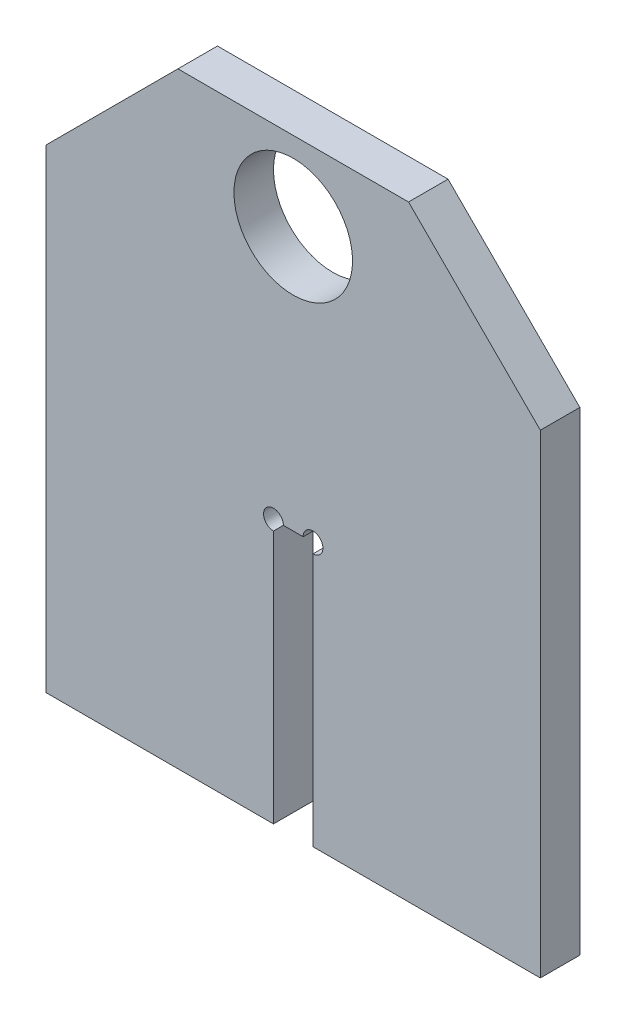
ISO-10303-21;
HEADER;
FILE_DESCRIPTION(('STEP AP214'),'2;1');
FILE_NAME('part.step','',(''),(''),'','','');
FILE_SCHEMA(('AUTOMOTIVE_DESIGN { 1 0 10303 214 1 1 1 1 }'));
ENDSEC;
DATA;
#1=APPLICATION_CONTEXT('core data for automotive mechanical design processes');
#2=APPLICATION_PROTOCOL_DEFINITION('international standard','automotive_design',2000,#1);
#3=PRODUCT_CONTEXT('',#1,'mechanical');
#4=PRODUCT('Part','Part','',(#3));
#5=PRODUCT_RELATED_PRODUCT_CATEGORY('part','',(#4));
#6=PRODUCT_DEFINITION_FORMATION('','',#4);
#7=PRODUCT_DEFINITION_CONTEXT('part definition',#1,'design');
#8=PRODUCT_DEFINITION('design','',#6,#7);
#9=PRODUCT_DEFINITION_SHAPE('','',#8);
#10=(LENGTH_UNIT() NAMED_UNIT(*) SI_UNIT(.MILLI.,.METRE.));
#11=(NAMED_UNIT(*) PLANE_ANGLE_UNIT() SI_UNIT($,.RADIAN.));
#12=(NAMED_UNIT(*) SI_UNIT($,.STERADIAN.) SOLID_ANGLE_UNIT());
#13=UNCERTAINTY_MEASURE_WITH_UNIT(LENGTH_MEASURE(1.E-05),#10,'distance_accuracy_value','');
#14=(GEOMETRIC_REPRESENTATION_CONTEXT(3) GLOBAL_UNCERTAINTY_ASSIGNED_CONTEXT((#13)) GLOBAL_UNIT_ASSIGNED_CONTEXT((#10,
#11,#12)) REPRESENTATION_CONTEXT('',''));
#15=CARTESIAN_POINT('',(0.,0.,0.));
#16=DIRECTION('',(0.,0.,1.));
#17=DIRECTION('',(1.,0.,0.));
#18=AXIS2_PLACEMENT_3D('',#15,#16,#17);
#19=CARTESIAN_POINT('',(9.64995895619307E-05,239.999937969991,124.697113534618));
#20=DIRECTION('',(0.,0.,-1.));
#21=DIRECTION('',(-1.,0.,0.));
#22=AXIS2_PLACEMENT_3D('',#19,#20,#21);
#23=CYLINDRICAL_SURFACE('',#22,9.00000000000002);
#24=CARTESIAN_POINT('',(9.64995895619307E-05,239.999937969991,5.99999999999992));
#25=DIRECTION('',(0.,0.,-1.));
#26=DIRECTION('',(-1.,0.,0.));
#27=AXIS2_PLACEMENT_3D('',#24,#25,#26);
#28=CIRCLE('',#27,9.00000000000002);
#29=CARTESIAN_POINT('',(-8.99990350041046,239.999937969991,5.99999999999992));
#30=VERTEX_POINT('',#29);
#31=EDGE_CURVE('E11',#30,#30,#28,.T.);
#32=ORIENTED_EDGE('',*,*,#31,.F.);
#33=EDGE_LOOP('',(#32));
#34=FACE_BOUND('',#33,.T.);
#35=CARTESIAN_POINT('',(9.64995895619307E-05,239.999937969991,0.));
#36=DIRECTION('',(0.,0.,1.));
#37=DIRECTION('',(1.,0.,0.));
#38=AXIS2_PLACEMENT_3D('',#35,#36,#37);
#39=CIRCLE('',#38,9.00000000000002);
#40=CARTESIAN_POINT('',(9.00009649958958,239.999937969991,0.));
#41=VERTEX_POINT('',#40);
#42=EDGE_CURVE('E157',#41,#41,#39,.T.);
#43=ORIENTED_EDGE('',*,*,#42,.F.);
#44=EDGE_LOOP('',(#43));
#45=FACE_BOUND('',#44,.T.);
#46=ADVANCED_FACE('F38',(#34,#45),#23,.F.);
#47=CARTESIAN_POINT('',(0.,0.,0.));
#48=DIRECTION('',(0.,0.,1.));
#49=DIRECTION('',(1.,0.,0.));
#50=AXIS2_PLACEMENT_3D('',#47,#48,#49);
#51=PLANE('',#50);
#52=ORIENTED_EDGE('',*,*,#42,.T.);
#53=EDGE_LOOP('',(#52));
#54=FACE_BOUND('',#53,.T.);
#55=CARTESIAN_POINT('',(3.00000000001348,200.,0.));
#56=DIRECTION('',(0.,0.,1.));
#57=DIRECTION('',(1.,0.,0.));
#58=AXIS2_PLACEMENT_3D('',#55,#56,#57);
#59=CIRCLE('',#58,1.5);
#60=CARTESIAN_POINT('',(3.00000000001348,198.5,0.));
#61=VERTEX_POINT('',#60);
#62=CARTESIAN_POINT('',(1.50000000001348,200.,0.));
#63=VERTEX_POINT('',#62);
#64=EDGE_CURVE('E146',#61,#63,#59,.T.);
#65=ORIENTED_EDGE('',*,*,#64,.T.);
#66=DIRECTION('',(1.,0.,0.));
#67=VECTOR('',#66,1.);
#68=CARTESIAN_POINT('',(0.,200.,0.));
#69=LINE('',#68,#67);
#70=CARTESIAN_POINT('',(-1.49999999998642,200.,0.));
#71=VERTEX_POINT('',#70);
#72=EDGE_CURVE('E199',#71,#63,#69,.T.);
#73=ORIENTED_EDGE('',*,*,#72,.F.);
#74=CARTESIAN_POINT('',(-2.99999999998642,200.,0.));
#75=DIRECTION('',(0.,0.,1.));
#76=DIRECTION('',(1.,0.,0.));
#77=AXIS2_PLACEMENT_3D('',#74,#75,#76);
#78=CIRCLE('',#77,1.5);
#79=CARTESIAN_POINT('',(-2.99999999998643,198.5,0.));
#80=VERTEX_POINT('',#79);
#81=EDGE_CURVE('E195',#71,#80,#78,.T.);
#82=ORIENTED_EDGE('',*,*,#81,.T.);
#83=DIRECTION('',(0.,1.,0.));
#84=VECTOR('',#83,1.);
#85=CARTESIAN_POINT('',(-2.99999999998755,0.,0.));
#86=LINE('',#85,#84);
#87=CARTESIAN_POINT('',(-2.99999999998665,160.,0.));
#88=VERTEX_POINT('',#87);
#89=EDGE_CURVE('E191',#88,#80,#86,.T.);
#90=ORIENTED_EDGE('',*,*,#89,.F.);
#91=DIRECTION('',(1.,0.,0.));
#92=VECTOR('',#91,1.);
#93=CARTESIAN_POINT('',(-1.28721510101417E-13,160.,0.));
#94=LINE('',#93,#92);
#95=CARTESIAN_POINT('',(-37.5,160.,0.));
#96=VERTEX_POINT('',#95);
#97=EDGE_CURVE('E187',#96,#88,#94,.T.);
#98=ORIENTED_EDGE('',*,*,#97,.F.);
#99=DIRECTION('',(0.,1.,0.));
#100=VECTOR('',#99,1.);
#101=CARTESIAN_POINT('',(-37.5000000000001,0.,0.));
#102=LINE('',#101,#100);
#103=CARTESIAN_POINT('',(-37.5,232.000025877441,0.));
#104=VERTEX_POINT('',#103);
#105=EDGE_CURVE('E183',#96,#104,#102,.T.);
#106=ORIENTED_EDGE('',*,*,#105,.T.);
#107=DIRECTION('',(-0.707106781186548,-0.707106781186547,0.));
#108=VECTOR('',#107,1.);
#109=CARTESIAN_POINT('',(-134.750012938721,134.750012938721,0.));
#110=LINE('',#109,#108);
#111=CARTESIAN_POINT('',(-17.5,252.000025877441,0.));
#112=VERTEX_POINT('',#111);
#113=EDGE_CURVE('E179',#112,#104,#110,.T.);
#114=ORIENTED_EDGE('',*,*,#113,.F.);
#115=DIRECTION('',(-1.,0.,0.));
#116=VECTOR('',#115,1.);
#117=CARTESIAN_POINT('',(0.,252.000025877441,0.));
#118=LINE('',#117,#116);
#119=CARTESIAN_POINT('',(17.5,252.000025877441,0.));
#120=VERTEX_POINT('',#119);
#121=EDGE_CURVE('E175',#120,#112,#118,.T.);
#122=ORIENTED_EDGE('',*,*,#121,.F.);
#123=DIRECTION('',(-0.707106781186548,0.707106781186547,0.));
#124=VECTOR('',#123,1.);
#125=CARTESIAN_POINT('',(134.750012938721,134.750012938721,0.));
#126=LINE('',#125,#124);
#127=CARTESIAN_POINT('',(37.5,232.000025877441,0.));
#128=VERTEX_POINT('',#127);
#129=EDGE_CURVE('E171',#128,#120,#126,.T.);
#130=ORIENTED_EDGE('',*,*,#129,.F.);
#131=DIRECTION('',(0.,1.,0.));
#132=VECTOR('',#131,1.);
#133=CARTESIAN_POINT('',(37.4999999999999,0.,0.));
#134=LINE('',#133,#132);
#135=CARTESIAN_POINT('',(37.5,160.,0.));
#136=VERTEX_POINT('',#135);
#137=EDGE_CURVE('E167',#136,#128,#134,.T.);
#138=ORIENTED_EDGE('',*,*,#137,.F.);
#139=DIRECTION('',(1.,0.,0.));
#140=VECTOR('',#139,1.);
#141=CARTESIAN_POINT('',(1.28721510101517E-13,160.,0.));
#142=LINE('',#141,#140);
#143=CARTESIAN_POINT('',(3.00000000001335,160.,0.));
#144=VERTEX_POINT('',#143);
#145=EDGE_CURVE('E149',#144,#136,#142,.T.);
#146=ORIENTED_EDGE('',*,*,#145,.F.);
#147=DIRECTION('',(0.,-1.,0.));
#148=VECTOR('',#147,1.);
#149=CARTESIAN_POINT('',(3.00000000001283,0.,0.));
#150=LINE('',#149,#148);
#151=EDGE_CURVE('E136',#61,#144,#150,.T.);
#152=ORIENTED_EDGE('',*,*,#151,.F.);
#153=EDGE_LOOP('',(#65,#73,#82,#90,#98,#106,#114,#122,#130,#138,#146,#152));
#154=FACE_BOUND('',#153,.T.);
#155=ADVANCED_FACE('F144',(#54,#154),#51,.F.);
#156=CARTESIAN_POINT('',(0.,200.,124.697113534618));
#157=DIRECTION('',(0.,1.,0.));
#158=DIRECTION('',(0.,0.,1.));
#159=AXIS2_PLACEMENT_3D('',#156,#157,#158);
#160=PLANE('',#159);
#161=DIRECTION('',(0.,0.,-1.));
#162=VECTOR('',#161,1.);
#163=CARTESIAN_POINT('',(1.50000000001348,200.,124.697113534618));
#164=LINE('',#163,#162);
#165=CARTESIAN_POINT('',(1.50000000001348,200.,5.99999999999991));
#166=VERTEX_POINT('',#165);
#167=EDGE_CURVE('E154',#166,#63,#164,.T.);
#168=ORIENTED_EDGE('',*,*,#167,.F.);
#169=DIRECTION('',(-1.,0.,0.));
#170=VECTOR('',#169,1.);
#171=CARTESIAN_POINT('',(0.,200.,5.99999999999991));
#172=LINE('',#171,#170);
#173=CARTESIAN_POINT('',(-1.49999999998642,200.,5.99999999999991));
#174=VERTEX_POINT('',#173);
#175=EDGE_CURVE('E41',#166,#174,#172,.T.);
#176=ORIENTED_EDGE('',*,*,#175,.T.);
#177=DIRECTION('',(0.,0.,-1.));
#178=VECTOR('',#177,1.);
#179=CARTESIAN_POINT('',(-1.49999999998642,200.,124.697113534618));
#180=LINE('',#179,#178);
#181=EDGE_CURVE('E204',#174,#71,#180,.T.);
#182=ORIENTED_EDGE('',*,*,#181,.T.);
#183=ORIENTED_EDGE('',*,*,#72,.T.);
#184=EDGE_LOOP('',(#168,#176,#182,#183));
#185=FACE_BOUND('',#184,.T.);
#186=ADVANCED_FACE('F298',(#185),#160,.F.);
#187=CARTESIAN_POINT('',(-2.99999999998642,200.,124.697113534618));
#188=DIRECTION('',(0.,0.,-1.));
#189=DIRECTION('',(-1.,0.,0.));
#190=AXIS2_PLACEMENT_3D('',#187,#188,#189);
#191=CYLINDRICAL_SURFACE('',#190,1.5);
#192=CARTESIAN_POINT('',(-2.99999999998642,200.,5.99999999999991));
#193=DIRECTION('',(0.,0.,-1.));
#194=DIRECTION('',(-1.,0.,0.));
#195=AXIS2_PLACEMENT_3D('',#192,#193,#194);
#196=CIRCLE('',#195,1.5);
#197=CARTESIAN_POINT('',(-2.99999999998643,198.5,5.99999999999991));
#198=VERTEX_POINT('',#197);
#199=EDGE_CURVE('E94',#198,#174,#196,.T.);
#200=ORIENTED_EDGE('',*,*,#199,.F.);
#201=DIRECTION('',(0.,0.,-1.));
#202=VECTOR('',#201,1.);
#203=CARTESIAN_POINT('',(-2.99999999998643,198.5,124.697113534618));
#204=LINE('',#203,#202);
#205=EDGE_CURVE('E207',#198,#80,#204,.T.);
#206=ORIENTED_EDGE('',*,*,#205,.T.);
#207=ORIENTED_EDGE('',*,*,#81,.F.);
#208=ORIENTED_EDGE('',*,*,#181,.F.);
#209=EDGE_LOOP('',(#200,#206,#207,#208));
#210=FACE_BOUND('',#209,.T.);
#211=ADVANCED_FACE('F301',(#210),#191,.F.);
#212=CARTESIAN_POINT('',(-2.99999999998755,0.,124.697113534618));
#213=DIRECTION('',(-1.,0.,0.));
#214=DIRECTION('',(0.,-1.,0.));
#215=AXIS2_PLACEMENT_3D('',#212,#213,#214);
#216=PLANE('',#215);
#217=ORIENTED_EDGE('',*,*,#205,.F.);
#218=DIRECTION('',(0.,-1.,0.));
#219=VECTOR('',#218,1.);
#220=CARTESIAN_POINT('',(-2.99999999998755,0.,5.99999999999989));
#221=LINE('',#220,#219);
#222=CARTESIAN_POINT('',(-2.99999999998665,160.,5.99999999999991));
#223=VERTEX_POINT('',#222);
#224=EDGE_CURVE('E57',#198,#223,#221,.T.);
#225=ORIENTED_EDGE('',*,*,#224,.T.);
#226=DIRECTION('',(0.,0.,-1.));
#227=VECTOR('',#226,1.);
#228=CARTESIAN_POINT('',(-2.99999999998665,160.,124.697113534618));
#229=LINE('',#228,#227);
#230=EDGE_CURVE('E210',#223,#88,#229,.T.);
#231=ORIENTED_EDGE('',*,*,#230,.T.);
#232=ORIENTED_EDGE('',*,*,#89,.T.);
#233=EDGE_LOOP('',(#217,#225,#231,#232));
#234=FACE_BOUND('',#233,.T.);
#235=ADVANCED_FACE('F293',(#234),#216,.F.);
#236=CARTESIAN_POINT('',(-1.28721510101417E-13,160.,124.697113534618));
#237=DIRECTION('',(0.,1.,0.));
#238=DIRECTION('',(-1.,0.,0.));
#239=AXIS2_PLACEMENT_3D('',#236,#237,#238);
#240=PLANE('',#239);
#241=ORIENTED_EDGE('',*,*,#230,.F.);
#242=DIRECTION('',(-1.,0.,0.));
#243=VECTOR('',#242,1.);
#244=CARTESIAN_POINT('',(-1.02365456420882E-13,160.,5.99999999999991));
#245=LINE('',#244,#243);
#246=CARTESIAN_POINT('',(-37.5,160.,5.9999999999999));
#247=VERTEX_POINT('',#246);
#248=EDGE_CURVE('E252',#223,#247,#245,.T.);
#249=ORIENTED_EDGE('',*,*,#248,.T.);
#250=DIRECTION('',(0.,0.,-1.));
#251=VECTOR('',#250,1.);
#252=CARTESIAN_POINT('',(-37.5,160.,124.697113534618));
#253=LINE('',#252,#251);
#254=EDGE_CURVE('E213',#247,#96,#253,.T.);
#255=ORIENTED_EDGE('',*,*,#254,.T.);
#256=ORIENTED_EDGE('',*,*,#97,.T.);
#257=EDGE_LOOP('',(#241,#249,#255,#256));
#258=FACE_BOUND('',#257,.T.);
#259=ADVANCED_FACE('F290',(#258),#240,.F.);
#260=CARTESIAN_POINT('',(-37.5000000000001,0.,124.697113534618));
#261=DIRECTION('',(-1.,0.,0.));
#262=DIRECTION('',(0.,-1.,0.));
#263=AXIS2_PLACEMENT_3D('',#260,#261,#262);
#264=PLANE('',#263);
#265=DIRECTION('',(0.,-1.,0.));
#266=VECTOR('',#265,1.);
#267=CARTESIAN_POINT('',(-37.5000000000001,0.,5.99999999999988));
#268=LINE('',#267,#266);
#269=CARTESIAN_POINT('',(-37.5,232.000025877441,5.99999999999991));
#270=VERTEX_POINT('',#269);
#271=EDGE_CURVE('E250',#270,#247,#268,.T.);
#272=ORIENTED_EDGE('',*,*,#271,.F.);
#273=DIRECTION('',(0.,0.,-1.));
#274=VECTOR('',#273,1.);
#275=CARTESIAN_POINT('',(-37.5,232.000025877441,124.697113534618));
#276=LINE('',#275,#274);
#277=EDGE_CURVE('E216',#270,#104,#276,.T.);
#278=ORIENTED_EDGE('',*,*,#277,.T.);
#279=ORIENTED_EDGE('',*,*,#105,.F.);
#280=ORIENTED_EDGE('',*,*,#254,.F.);
#281=EDGE_LOOP('',(#272,#278,#279,#280));
#282=FACE_BOUND('',#281,.T.);
#283=ADVANCED_FACE('F286',(#282),#264,.T.);
#284=CARTESIAN_POINT('',(-134.750012938721,134.750012938721,124.697113534618));
#285=DIRECTION('',(0.707106781186547,-0.707106781186548,0.));
#286=DIRECTION('',(0.707106781186548,0.707106781186547,0.));
#287=AXIS2_PLACEMENT_3D('',#284,#285,#286);
#288=PLANE('',#287);
#289=ORIENTED_EDGE('',*,*,#277,.F.);
#290=DIRECTION('',(0.707106781186548,0.707106781186547,0.));
#291=VECTOR('',#290,1.);
#292=CARTESIAN_POINT('',(-134.750012938721,134.750012938721,5.99999999999988));
#293=LINE('',#292,#291);
#294=CARTESIAN_POINT('',(-17.5,252.000025877441,5.99999999999992));
#295=VERTEX_POINT('',#294);
#296=EDGE_CURVE('E251',#270,#295,#293,.T.);
#297=ORIENTED_EDGE('',*,*,#296,.T.);
#298=DIRECTION('',(0.,0.,-1.));
#299=VECTOR('',#298,1.);
#300=CARTESIAN_POINT('',(-17.5,252.000025877441,124.697113534618));
#301=LINE('',#300,#299);
#302=EDGE_CURVE('E219',#295,#112,#301,.T.);
#303=ORIENTED_EDGE('',*,*,#302,.T.);
#304=ORIENTED_EDGE('',*,*,#113,.T.);
#305=EDGE_LOOP('',(#289,#297,#303,#304));
#306=FACE_BOUND('',#305,.T.);
#307=ADVANCED_FACE('F283',(#306),#288,.F.);
#308=CARTESIAN_POINT('',(0.,252.000025877441,124.697113534618));
#309=DIRECTION('',(0.,-1.,0.));
#310=DIRECTION('',(0.,0.,-1.));
#311=AXIS2_PLACEMENT_3D('',#308,#309,#310);
#312=PLANE('',#311);
#313=ORIENTED_EDGE('',*,*,#302,.F.);
#314=DIRECTION('',(1.,0.,0.));
#315=VECTOR('',#314,1.);
#316=CARTESIAN_POINT('',(0.,252.000025877441,5.99999999999992));
#317=LINE('',#316,#315);
#318=CARTESIAN_POINT('',(17.5,252.000025877441,5.99999999999993));
#319=VERTEX_POINT('',#318);
#320=EDGE_CURVE('E258',#295,#319,#317,.T.);
#321=ORIENTED_EDGE('',*,*,#320,.T.);
#322=DIRECTION('',(0.,0.,-1.));
#323=VECTOR('',#322,1.);
#324=CARTESIAN_POINT('',(17.5,252.000025877441,124.697113534618));
#325=LINE('',#324,#323);
#326=EDGE_CURVE('E222',#319,#120,#325,.T.);
#327=ORIENTED_EDGE('',*,*,#326,.T.);
#328=ORIENTED_EDGE('',*,*,#121,.T.);
#329=EDGE_LOOP('',(#313,#321,#327,#328));
#330=FACE_BOUND('',#329,.T.);
#331=ADVANCED_FACE('F280',(#330),#312,.F.);
#332=CARTESIAN_POINT('',(134.750012938721,134.750012938721,124.697113534618));
#333=DIRECTION('',(-0.707106781186547,-0.707106781186548,0.));
#334=DIRECTION('',(0.707106781186548,-0.707106781186547,0.));
#335=AXIS2_PLACEMENT_3D('',#332,#333,#334);
#336=PLANE('',#335);
#337=ORIENTED_EDGE('',*,*,#326,.F.);
#338=DIRECTION('',(0.707106781186548,-0.707106781186547,0.));
#339=VECTOR('',#338,1.);
#340=CARTESIAN_POINT('',(134.750012938721,134.750012938721,5.99999999999994));
#341=LINE('',#340,#339);
#342=CARTESIAN_POINT('',(37.5,232.000025877441,5.99999999999993));
#343=VERTEX_POINT('',#342);
#344=EDGE_CURVE('E244',#319,#343,#341,.T.);
#345=ORIENTED_EDGE('',*,*,#344,.T.);
#346=DIRECTION('',(0.,0.,-1.));
#347=VECTOR('',#346,1.);
#348=CARTESIAN_POINT('',(37.5,232.000025877441,124.697113534618));
#349=LINE('',#348,#347);
#350=EDGE_CURVE('E225',#343,#128,#349,.T.);
#351=ORIENTED_EDGE('',*,*,#350,.T.);
#352=ORIENTED_EDGE('',*,*,#129,.T.);
#353=EDGE_LOOP('',(#337,#345,#351,#352));
#354=FACE_BOUND('',#353,.T.);
#355=ADVANCED_FACE('F270',(#354),#336,.F.);
#356=CARTESIAN_POINT('',(37.4999999999999,0.,124.697113534618));
#357=DIRECTION('',(-1.,0.,0.));
#358=DIRECTION('',(0.,-1.,0.));
#359=AXIS2_PLACEMENT_3D('',#356,#357,#358);
#360=PLANE('',#359);
#361=ORIENTED_EDGE('',*,*,#350,.F.);
#362=DIRECTION('',(0.,-1.,0.));
#363=VECTOR('',#362,1.);
#364=CARTESIAN_POINT('',(37.4999999999999,0.,5.99999999999989));
#365=LINE('',#364,#363);
#366=CARTESIAN_POINT('',(37.5,160.,5.99999999999991));
#367=VERTEX_POINT('',#366);
#368=EDGE_CURVE('E238',#343,#367,#365,.T.);
#369=ORIENTED_EDGE('',*,*,#368,.T.);
#370=DIRECTION('',(0.,0.,-1.));
#371=VECTOR('',#370,1.);
#372=CARTESIAN_POINT('',(37.5,160.,124.697113534618));
#373=LINE('',#372,#371);
#374=EDGE_CURVE('E228',#367,#136,#373,.T.);
#375=ORIENTED_EDGE('',*,*,#374,.T.);
#376=ORIENTED_EDGE('',*,*,#137,.T.);
#377=EDGE_LOOP('',(#361,#369,#375,#376));
#378=FACE_BOUND('',#377,.T.);
#379=ADVANCED_FACE('F276',(#378),#360,.F.);
#380=CARTESIAN_POINT('',(1.28721510101517E-13,160.,124.697113534618));
#381=DIRECTION('',(0.,1.,0.));
#382=DIRECTION('',(-1.,0.,0.));
#383=AXIS2_PLACEMENT_3D('',#380,#381,#382);
#384=PLANE('',#383);
#385=ORIENTED_EDGE('',*,*,#374,.F.);
#386=DIRECTION('',(-1.,0.,0.));
#387=VECTOR('',#386,1.);
#388=CARTESIAN_POINT('',(1.55077563782053E-13,160.,5.99999999999991));
#389=LINE('',#388,#387);
#390=CARTESIAN_POINT('',(3.00000000001335,160.,5.99999999999991));
#391=VERTEX_POINT('',#390);
#392=EDGE_CURVE('E236',#367,#391,#389,.T.);
#393=ORIENTED_EDGE('',*,*,#392,.T.);
#394=DIRECTION('',(0.,0.,-1.));
#395=VECTOR('',#394,1.);
#396=CARTESIAN_POINT('',(3.00000000001335,160.,124.697113534618));
#397=LINE('',#396,#395);
#398=EDGE_CURVE('E140',#391,#144,#397,.T.);
#399=ORIENTED_EDGE('',*,*,#398,.T.);
#400=ORIENTED_EDGE('',*,*,#145,.T.);
#401=EDGE_LOOP('',(#385,#393,#399,#400));
#402=FACE_BOUND('',#401,.T.);
#403=ADVANCED_FACE('F235',(#402),#384,.F.);
#404=CARTESIAN_POINT('',(3.00000000001283,0.,124.697113534618));
#405=DIRECTION('',(1.,0.,0.));
#406=DIRECTION('',(0.,1.,0.));
#407=AXIS2_PLACEMENT_3D('',#404,#405,#406);
#408=PLANE('',#407);
#409=ORIENTED_EDGE('',*,*,#398,.F.);
#410=DIRECTION('',(0.,1.,0.));
#411=VECTOR('',#410,1.);
#412=CARTESIAN_POINT('',(3.00000000001283,0.,5.99999999999989));
#413=LINE('',#412,#411);
#414=CARTESIAN_POINT('',(3.00000000001348,198.5,5.99999999999992));
#415=VERTEX_POINT('',#414);
#416=EDGE_CURVE('E85',#391,#415,#413,.T.);
#417=ORIENTED_EDGE('',*,*,#416,.T.);
#418=DIRECTION('',(0.,0.,-1.));
#419=VECTOR('',#418,1.);
#420=CARTESIAN_POINT('',(3.00000000001348,198.5,124.697113534618));
#421=LINE('',#420,#419);
#422=EDGE_CURVE('E133',#415,#61,#421,.T.);
#423=ORIENTED_EDGE('',*,*,#422,.T.);
#424=ORIENTED_EDGE('',*,*,#151,.T.);
#425=EDGE_LOOP('',(#409,#417,#423,#424));
#426=FACE_BOUND('',#425,.T.);
#427=ADVANCED_FACE('F135',(#426),#408,.F.);
#428=CARTESIAN_POINT('',(3.00000000001348,200.,124.697113534618));
#429=DIRECTION('',(0.,0.,-1.));
#430=DIRECTION('',(-1.,0.,0.));
#431=AXIS2_PLACEMENT_3D('',#428,#429,#430);
#432=CYLINDRICAL_SURFACE('',#431,1.5);
#433=CARTESIAN_POINT('',(3.00000000001348,200.,5.99999999999992));
#434=DIRECTION('',(0.,0.,-1.));
#435=DIRECTION('',(-1.,0.,0.));
#436=AXIS2_PLACEMENT_3D('',#433,#434,#435);
#437=CIRCLE('',#436,1.5);
#438=EDGE_CURVE('E48',#166,#415,#437,.T.);
#439=ORIENTED_EDGE('',*,*,#438,.F.);
#440=ORIENTED_EDGE('',*,*,#167,.T.);
#441=ORIENTED_EDGE('',*,*,#64,.F.);
#442=ORIENTED_EDGE('',*,*,#422,.F.);
#443=EDGE_LOOP('',(#439,#440,#441,#442));
#444=FACE_BOUND('',#443,.T.);
#445=ADVANCED_FACE('F152',(#444),#432,.F.);
#446=CARTESIAN_POINT('',(-855.5992052357,-1.02904887996392E-13,5.9999999999997));
#447=DIRECTION('',(0.,0.,-1.));
#448=DIRECTION('',(-1.,0.,0.));
#449=AXIS2_PLACEMENT_3D('',#446,#447,#448);
#450=PLANE('',#449);
#451=ORIENTED_EDGE('',*,*,#31,.T.);
#452=EDGE_LOOP('',(#451));
#453=FACE_BOUND('',#452,.T.);
#454=ORIENTED_EDGE('',*,*,#438,.T.);
#455=ORIENTED_EDGE('',*,*,#416,.F.);
#456=ORIENTED_EDGE('',*,*,#392,.F.);
#457=ORIENTED_EDGE('',*,*,#368,.F.);
#458=ORIENTED_EDGE('',*,*,#344,.F.);
#459=ORIENTED_EDGE('',*,*,#320,.F.);
#460=ORIENTED_EDGE('',*,*,#296,.F.);
#461=ORIENTED_EDGE('',*,*,#271,.T.);
#462=ORIENTED_EDGE('',*,*,#248,.F.);
#463=ORIENTED_EDGE('',*,*,#224,.F.);
#464=ORIENTED_EDGE('',*,*,#199,.T.);
#465=ORIENTED_EDGE('',*,*,#175,.F.);
#466=EDGE_LOOP('',(#454,#455,#456,#457,#458,#459,#460,#461,#462,#463,#464,#465));
#467=FACE_BOUND('',#466,.T.);
#468=ADVANCED_FACE('F273',(#453,#467),#450,.F.);
#469=CLOSED_SHELL('',(#46,#155,#186,#211,#235,#259,#283,#307,#331,#355,#379,#403,#427,#445,#468));
#470=MANIFOLD_SOLID_BREP('B2',#469);
#471=ADVANCED_BREP_SHAPE_REPRESENTATION('',(#18,#470),#14);
#472=SHAPE_DEFINITION_REPRESENTATION(#9,#471);
ENDSEC;
END-ISO-10303-21;
